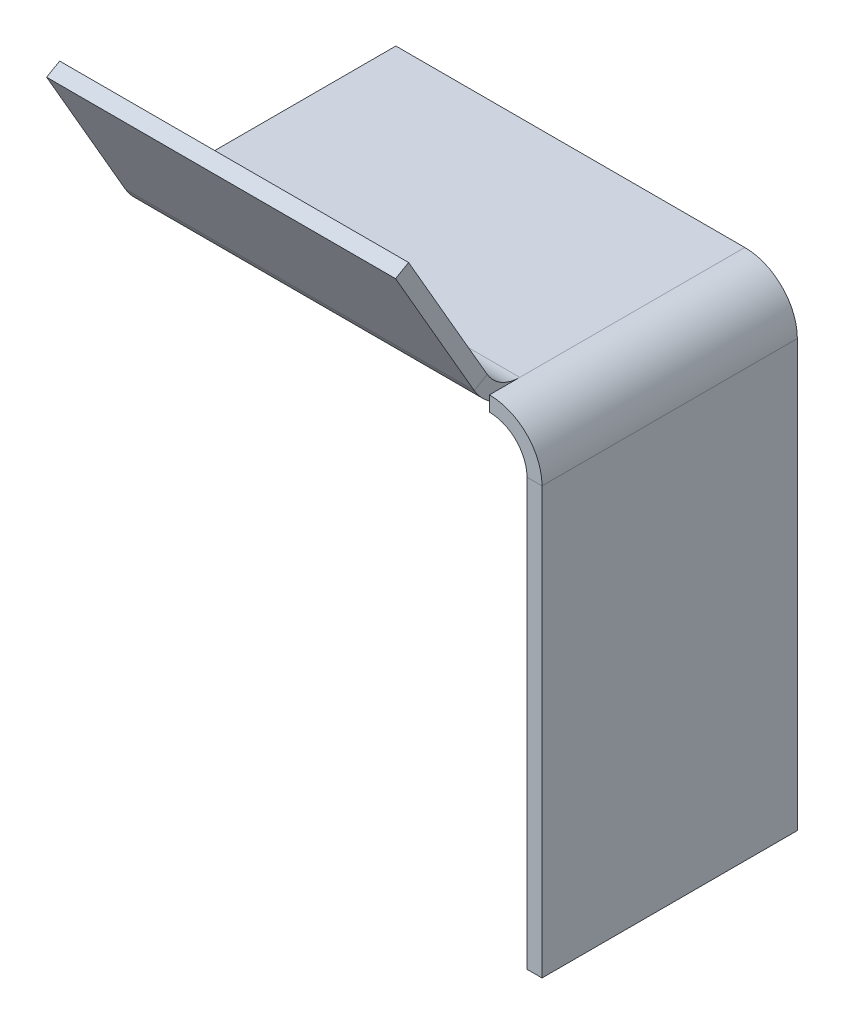
ISO-10303-21;
HEADER;
FILE_DESCRIPTION(('STEP AP214'),'2;1');
FILE_NAME('part.step','',(''),(''),'','','');
FILE_SCHEMA(('AUTOMOTIVE_DESIGN { 1 0 10303 214 1 1 1 1 }'));
ENDSEC;
DATA;
#1=APPLICATION_CONTEXT('core data for automotive mechanical design processes');
#2=APPLICATION_PROTOCOL_DEFINITION('international standard','automotive_design',2000,#1);
#3=PRODUCT_CONTEXT('',#1,'mechanical');
#4=PRODUCT('Part','Part','',(#3));
#5=PRODUCT_RELATED_PRODUCT_CATEGORY('part','',(#4));
#6=PRODUCT_DEFINITION_FORMATION('','',#4);
#7=PRODUCT_DEFINITION_CONTEXT('part definition',#1,'design');
#8=PRODUCT_DEFINITION('design','',#6,#7);
#9=PRODUCT_DEFINITION_SHAPE('','',#8);
#10=(LENGTH_UNIT() NAMED_UNIT(*) SI_UNIT(.MILLI.,.METRE.));
#11=(NAMED_UNIT(*) PLANE_ANGLE_UNIT() SI_UNIT($,.RADIAN.));
#12=(NAMED_UNIT(*) SI_UNIT($,.STERADIAN.) SOLID_ANGLE_UNIT());
#13=UNCERTAINTY_MEASURE_WITH_UNIT(LENGTH_MEASURE(1.E-05),#10,'distance_accuracy_value','');
#14=(GEOMETRIC_REPRESENTATION_CONTEXT(3) GLOBAL_UNCERTAINTY_ASSIGNED_CONTEXT((#13)) GLOBAL_UNIT_ASSIGNED_CONTEXT((#10,
#11,#12)) REPRESENTATION_CONTEXT('',''));
#15=CARTESIAN_POINT('',(0.,0.,0.));
#16=DIRECTION('',(0.,0.,1.));
#17=DIRECTION('',(1.,0.,0.));
#18=AXIS2_PLACEMENT_3D('',#15,#16,#17);
#19=CARTESIAN_POINT('',(-7.,63.7433555035391,34.));
#20=DIRECTION('',(-1.,0.,0.));
#21=DIRECTION('',(0.,0.,1.));
#22=AXIS2_PLACEMENT_3D('',#19,#20,#21);
#23=PLANE('',#22);
#24=DIRECTION('',(0.,1.,0.));
#25=VECTOR('',#24,1.);
#26=CARTESIAN_POINT('',(-7.,61.7433555035391,34.));
#27=LINE('',#26,#25);
#28=CARTESIAN_POINT('',(-7.,61.7433555035391,34.));
#29=VERTEX_POINT('',#28);
#30=CARTESIAN_POINT('',(-7.,63.027879437045,34.));
#31=VERTEX_POINT('',#30);
#32=EDGE_CURVE('E277',#29,#31,#27,.T.);
#33=ORIENTED_EDGE('',*,*,#32,.T.);
#34=CARTESIAN_POINT('',(-7.,68.7433555035391,29.9585481156727));
#35=DIRECTION('',(1.,0.,0.));
#36=DIRECTION('',(0.,0.,-1.));
#37=AXIS2_PLACEMENT_3D('',#34,#35,#36);
#38=CIRCLE('',#37,7.);
#39=CARTESIAN_POINT('',(-7.,61.7433555035391,29.9585481156727));
#40=VERTEX_POINT('',#39);
#41=EDGE_CURVE('E13',#31,#40,#38,.T.);
#42=ORIENTED_EDGE('',*,*,#41,.T.);
#43=DIRECTION('',(0.,0.,-1.));
#44=VECTOR('',#43,1.);
#45=CARTESIAN_POINT('',(-7.,61.7433555035391,34.));
#46=LINE('',#45,#44);
#47=EDGE_CURVE('E266',#29,#40,#46,.T.);
#48=ORIENTED_EDGE('',*,*,#47,.F.);
#49=EDGE_LOOP('',(#33,#42,#48));
#50=FACE_BOUND('',#49,.T.);
#51=ADVANCED_FACE('F54',(#50),#23,.T.);
#52=CARTESIAN_POINT('',(0.,63.7433555035391,34.));
#53=DIRECTION('',(0.,-1.,0.));
#54=DIRECTION('',(0.,0.,-1.));
#55=AXIS2_PLACEMENT_3D('',#52,#53,#54);
#56=PLANE('',#55);
#57=DIRECTION('',(1.,0.,0.));
#58=VECTOR('',#57,1.);
#59=CARTESIAN_POINT('',(-7.,63.7433555035391,29.9585481156727));
#60=LINE('',#59,#58);
#61=CARTESIAN_POINT('',(-7.,63.7433555035391,29.9585481156727));
#62=VERTEX_POINT('',#61);
#63=CARTESIAN_POINT('',(-53.4621691320006,63.7433555035391,29.9585481156727));
#64=VERTEX_POINT('',#63);
#65=EDGE_CURVE('E206',#62,#64,#60,.F.);
#66=ORIENTED_EDGE('',*,*,#65,.F.);
#67=DIRECTION('',(0.,0.,-1.));
#68=VECTOR('',#67,1.);
#69=CARTESIAN_POINT('',(-7.,63.7433555035391,34.));
#70=LINE('',#69,#68);
#71=CARTESIAN_POINT('',(-7.,63.7433555035391,0.));
#72=VERTEX_POINT('',#71);
#73=EDGE_CURVE('E229',#62,#72,#70,.T.);
#74=ORIENTED_EDGE('',*,*,#73,.T.);
#75=DIRECTION('',(-1.,0.,0.));
#76=VECTOR('',#75,1.);
#77=CARTESIAN_POINT('',(0.,63.7433555035391,0.));
#78=LINE('',#77,#76);
#79=CARTESIAN_POINT('',(-53.4621691320006,63.7433555035391,0.));
#80=VERTEX_POINT('',#79);
#81=EDGE_CURVE('E213',#72,#80,#78,.T.);
#82=ORIENTED_EDGE('',*,*,#81,.T.);
#83=DIRECTION('',(0.,0.,-1.));
#84=VECTOR('',#83,1.);
#85=CARTESIAN_POINT('',(-53.4621691320006,63.7433555035391,34.));
#86=LINE('',#85,#84);
#87=EDGE_CURVE('E271',#64,#80,#86,.T.);
#88=ORIENTED_EDGE('',*,*,#87,.F.);
#89=EDGE_LOOP('',(#66,#74,#82,#88));
#90=FACE_BOUND('',#89,.T.);
#91=ADVANCED_FACE('F321',(#90),#56,.F.);
#92=CARTESIAN_POINT('',(0.,61.7433555035391,34.));
#93=DIRECTION('',(0.,-1.,0.));
#94=DIRECTION('',(0.,0.,-1.));
#95=AXIS2_PLACEMENT_3D('',#92,#93,#94);
#96=PLANE('',#95);
#97=CARTESIAN_POINT('',(-7.,61.7433555035391,0.));
#98=VERTEX_POINT('',#97);
#99=EDGE_CURVE('E265',#40,#98,#46,.T.);
#100=ORIENTED_EDGE('',*,*,#99,.F.);
#101=DIRECTION('',(1.,0.,0.));
#102=VECTOR('',#101,1.);
#103=CARTESIAN_POINT('',(-7.,61.7433555035391,29.9585481156727));
#104=LINE('',#103,#102);
#105=CARTESIAN_POINT('',(-53.4621691320006,61.7433555035391,29.9585481156727));
#106=VERTEX_POINT('',#105);
#107=EDGE_CURVE('E197',#40,#106,#104,.F.);
#108=ORIENTED_EDGE('',*,*,#107,.T.);
#109=DIRECTION('',(0.,0.,-1.));
#110=VECTOR('',#109,1.);
#111=CARTESIAN_POINT('',(-53.4621691320006,61.7433555035391,34.));
#112=LINE('',#111,#110);
#113=CARTESIAN_POINT('',(-53.4621691320006,61.7433555035391,0.));
#114=VERTEX_POINT('',#113);
#115=EDGE_CURVE('E269',#106,#114,#112,.T.);
#116=ORIENTED_EDGE('',*,*,#115,.T.);
#117=DIRECTION('',(1.,0.,0.));
#118=VECTOR('',#117,1.);
#119=CARTESIAN_POINT('',(0.,61.7433555035391,0.));
#120=LINE('',#119,#118);
#121=EDGE_CURVE('E235',#98,#114,#120,.F.);
#122=ORIENTED_EDGE('',*,*,#121,.F.);
#123=EDGE_LOOP('',(#100,#108,#116,#122));
#124=FACE_BOUND('',#123,.T.);
#125=ADVANCED_FACE('F292',(#124),#96,.T.);
#126=CARTESIAN_POINT('',(0.,56.7433555035391,34.));
#127=DIRECTION('',(0.,0.,1.));
#128=DIRECTION('',(1.,0.,0.));
#129=AXIS2_PLACEMENT_3D('',#126,#127,#128);
#130=PLANE('',#129);
#131=DIRECTION('',(-1.,0.,0.));
#132=VECTOR('',#131,1.);
#133=CARTESIAN_POINT('',(0.,56.7433555035391,34.));
#134=LINE('',#133,#132);
#135=CARTESIAN_POINT('',(0.,56.7433555035391,34.));
#136=VERTEX_POINT('',#135);
#137=CARTESIAN_POINT('',(-2.,56.7433555035391,34.));
#138=VERTEX_POINT('',#137);
#139=EDGE_CURVE('E58',#136,#138,#134,.T.);
#140=ORIENTED_EDGE('',*,*,#139,.F.);
#141=CARTESIAN_POINT('',(-7.,56.7433555035391,34.));
#142=DIRECTION('',(0.,0.,-1.));
#143=DIRECTION('',(-1.,0.,0.));
#144=AXIS2_PLACEMENT_3D('',#141,#142,#143);
#145=CIRCLE('',#144,7.);
#146=CARTESIAN_POINT('',(-7.,63.7433555035391,34.));
#147=VERTEX_POINT('',#146);
#148=EDGE_CURVE('E227',#136,#147,#145,.F.);
#149=ORIENTED_EDGE('',*,*,#148,.T.);
#150=EDGE_CURVE('E71',#31,#147,#27,.T.);
#151=ORIENTED_EDGE('',*,*,#150,.F.);
#152=ORIENTED_EDGE('',*,*,#32,.F.);
#153=CARTESIAN_POINT('',(-7.,56.7433555035391,34.));
#154=DIRECTION('',(0.,0.,1.));
#155=DIRECTION('',(1.,0.,0.));
#156=AXIS2_PLACEMENT_3D('',#153,#154,#155);
#157=CIRCLE('',#156,5.);
#158=EDGE_CURVE('E214',#138,#29,#157,.T.);
#159=ORIENTED_EDGE('',*,*,#158,.F.);
#160=EDGE_LOOP('',(#140,#149,#151,#152,#159));
#161=FACE_BOUND('',#160,.T.);
#162=ADVANCED_FACE('F56',(#161),#130,.T.);
#163=CARTESIAN_POINT('',(-7.,61.7433555035391,34.));
#164=DIRECTION('',(0.,0.,1.));
#165=DIRECTION('',(1.,0.,0.));
#166=AXIS2_PLACEMENT_3D('',#163,#164,#165);
#167=PLANE('',#166);
#168=DIRECTION('',(0.,1.,0.));
#169=VECTOR('',#168,1.);
#170=CARTESIAN_POINT('',(0.,0.,34.));
#171=LINE('',#170,#169);
#172=CARTESIAN_POINT('',(0.,0.,34.));
#173=VERTEX_POINT('',#172);
#174=EDGE_CURVE('E224',#173,#136,#171,.T.);
#175=ORIENTED_EDGE('',*,*,#174,.T.);
#176=ORIENTED_EDGE('',*,*,#139,.T.);
#177=DIRECTION('',(0.,1.,0.));
#178=VECTOR('',#177,1.);
#179=CARTESIAN_POINT('',(-2.,0.,34.));
#180=LINE('',#179,#178);
#181=CARTESIAN_POINT('',(-2.,0.,34.));
#182=VERTEX_POINT('',#181);
#183=EDGE_CURVE('E217',#182,#138,#180,.T.);
#184=ORIENTED_EDGE('',*,*,#183,.F.);
#185=DIRECTION('',(-1.,0.,0.));
#186=VECTOR('',#185,1.);
#187=CARTESIAN_POINT('',(0.,0.,34.));
#188=LINE('',#187,#186);
#189=EDGE_CURVE('E221',#173,#182,#188,.T.);
#190=ORIENTED_EDGE('',*,*,#189,.F.);
#191=EDGE_LOOP('',(#175,#176,#184,#190));
#192=FACE_BOUND('',#191,.T.);
#193=ADVANCED_FACE('F304',(#192),#167,.T.);
#194=CARTESIAN_POINT('',(-7.,63.7433555035391,0.));
#195=DIRECTION('',(0.,0.,-1.));
#196=DIRECTION('',(-1.,0.,0.));
#197=AXIS2_PLACEMENT_3D('',#194,#195,#196);
#198=PLANE('',#197);
#199=DIRECTION('',(0.,-1.,0.));
#200=VECTOR('',#199,1.);
#201=CARTESIAN_POINT('',(-7.,63.7433555035391,0.));
#202=LINE('',#201,#200);
#203=EDGE_CURVE('E275',#72,#98,#202,.T.);
#204=ORIENTED_EDGE('',*,*,#203,.F.);
#205=CARTESIAN_POINT('',(-7.,56.7433555035391,0.));
#206=DIRECTION('',(0.,0.,-1.));
#207=DIRECTION('',(-1.,0.,0.));
#208=AXIS2_PLACEMENT_3D('',#205,#206,#207);
#209=CIRCLE('',#208,7.);
#210=CARTESIAN_POINT('',(0.,56.7433555035391,0.));
#211=VERTEX_POINT('',#210);
#212=EDGE_CURVE('E218',#211,#72,#209,.F.);
#213=ORIENTED_EDGE('',*,*,#212,.F.);
#214=DIRECTION('',(1.,0.,0.));
#215=VECTOR('',#214,1.);
#216=CARTESIAN_POINT('',(-2.,56.7433555035391,0.));
#217=LINE('',#216,#215);
#218=CARTESIAN_POINT('',(-2.,56.7433555035391,0.));
#219=VERTEX_POINT('',#218);
#220=EDGE_CURVE('E273',#219,#211,#217,.T.);
#221=ORIENTED_EDGE('',*,*,#220,.F.);
#222=CARTESIAN_POINT('',(-7.,56.7433555035391,0.));
#223=DIRECTION('',(0.,0.,1.));
#224=DIRECTION('',(1.,0.,0.));
#225=AXIS2_PLACEMENT_3D('',#222,#223,#224);
#226=CIRCLE('',#225,5.);
#227=EDGE_CURVE('E238',#219,#98,#226,.T.);
#228=ORIENTED_EDGE('',*,*,#227,.T.);
#229=EDGE_LOOP('',(#204,#213,#221,#228));
#230=FACE_BOUND('',#229,.T.);
#231=ADVANCED_FACE('F364',(#230),#198,.T.);
#232=CARTESIAN_POINT('',(-2.,56.7433555035391,0.));
#233=DIRECTION('',(0.,0.,-1.));
#234=DIRECTION('',(-1.,0.,0.));
#235=AXIS2_PLACEMENT_3D('',#232,#233,#234);
#236=PLANE('',#235);
#237=ORIENTED_EDGE('',*,*,#81,.F.);
#238=ORIENTED_EDGE('',*,*,#203,.T.);
#239=ORIENTED_EDGE('',*,*,#121,.T.);
#240=DIRECTION('',(0.,1.,0.));
#241=VECTOR('',#240,1.);
#242=CARTESIAN_POINT('',(-53.4621691320006,61.7433555035391,0.));
#243=LINE('',#242,#241);
#244=EDGE_CURVE('E232',#114,#80,#243,.T.);
#245=ORIENTED_EDGE('',*,*,#244,.T.);
#246=EDGE_LOOP('',(#237,#238,#239,#245));
#247=FACE_BOUND('',#246,.T.);
#248=ADVANCED_FACE('F360',(#247),#236,.T.);
#249=CARTESIAN_POINT('',(-53.4621691320006,61.7433555035391,34.));
#250=DIRECTION('',(-1.,0.,0.));
#251=DIRECTION('',(0.,0.,1.));
#252=AXIS2_PLACEMENT_3D('',#249,#250,#251);
#253=PLANE('',#252);
#254=DIRECTION('',(0.,-1.,0.));
#255=VECTOR('',#254,1.);
#256=CARTESIAN_POINT('',(-53.4621691320006,63.7433555035391,29.9585481156727));
#257=LINE('',#256,#255);
#258=EDGE_CURVE('E79',#64,#106,#257,.T.);
#259=ORIENTED_EDGE('',*,*,#258,.F.);
#260=ORIENTED_EDGE('',*,*,#87,.T.);
#261=ORIENTED_EDGE('',*,*,#244,.F.);
#262=ORIENTED_EDGE('',*,*,#115,.F.);
#263=EDGE_LOOP('',(#259,#260,#261,#262));
#264=FACE_BOUND('',#263,.T.);
#265=ADVANCED_FACE('F356',(#264),#253,.T.);
#266=CARTESIAN_POINT('',(-7.,56.7433555035391,34.));
#267=DIRECTION('',(0.,0.,-1.));
#268=DIRECTION('',(-1.,0.,0.));
#269=AXIS2_PLACEMENT_3D('',#266,#267,#268);
#270=CYLINDRICAL_SURFACE('',#269,5.);
#271=ORIENTED_EDGE('',*,*,#227,.F.);
#272=DIRECTION('',(0.,0.,-1.));
#273=VECTOR('',#272,1.);
#274=CARTESIAN_POINT('',(-2.,56.7433555035391,34.));
#275=LINE('',#274,#273);
#276=EDGE_CURVE('E262',#138,#219,#275,.T.);
#277=ORIENTED_EDGE('',*,*,#276,.F.);
#278=ORIENTED_EDGE('',*,*,#158,.T.);
#279=ORIENTED_EDGE('',*,*,#47,.T.);
#280=ORIENTED_EDGE('',*,*,#99,.T.);
#281=EDGE_LOOP('',(#271,#277,#278,#279,#280));
#282=FACE_BOUND('',#281,.T.);
#283=ADVANCED_FACE('F295',(#282),#270,.F.);
#284=CARTESIAN_POINT('',(-2.,0.,34.));
#285=DIRECTION('',(-1.,0.,0.));
#286=DIRECTION('',(0.,0.,1.));
#287=AXIS2_PLACEMENT_3D('',#284,#285,#286);
#288=PLANE('',#287);
#289=DIRECTION('',(0.,1.,0.));
#290=VECTOR('',#289,1.);
#291=CARTESIAN_POINT('',(-2.,0.,0.));
#292=LINE('',#291,#290);
#293=CARTESIAN_POINT('',(-2.,0.,0.));
#294=VERTEX_POINT('',#293);
#295=EDGE_CURVE('E241',#294,#219,#292,.T.);
#296=ORIENTED_EDGE('',*,*,#295,.F.);
#297=DIRECTION('',(0.,0.,-1.));
#298=VECTOR('',#297,1.);
#299=CARTESIAN_POINT('',(-2.,0.,34.));
#300=LINE('',#299,#298);
#301=EDGE_CURVE('E260',#182,#294,#300,.T.);
#302=ORIENTED_EDGE('',*,*,#301,.F.);
#303=ORIENTED_EDGE('',*,*,#183,.T.);
#304=ORIENTED_EDGE('',*,*,#276,.T.);
#305=EDGE_LOOP('',(#296,#302,#303,#304));
#306=FACE_BOUND('',#305,.T.);
#307=ADVANCED_FACE('F301',(#306),#288,.T.);
#308=CARTESIAN_POINT('',(0.,0.,34.));
#309=DIRECTION('',(0.,-1.,0.));
#310=DIRECTION('',(0.,0.,-1.));
#311=AXIS2_PLACEMENT_3D('',#308,#309,#310);
#312=PLANE('',#311);
#313=DIRECTION('',(-1.,0.,0.));
#314=VECTOR('',#313,1.);
#315=CARTESIAN_POINT('',(0.,0.,0.));
#316=LINE('',#315,#314);
#317=CARTESIAN_POINT('',(0.,0.,0.));
#318=VERTEX_POINT('',#317);
#319=EDGE_CURVE('E244',#318,#294,#316,.T.);
#320=ORIENTED_EDGE('',*,*,#319,.F.);
#321=DIRECTION('',(0.,0.,-1.));
#322=VECTOR('',#321,1.);
#323=CARTESIAN_POINT('',(0.,0.,34.));
#324=LINE('',#323,#322);
#325=EDGE_CURVE('E258',#173,#318,#324,.T.);
#326=ORIENTED_EDGE('',*,*,#325,.F.);
#327=ORIENTED_EDGE('',*,*,#189,.T.);
#328=ORIENTED_EDGE('',*,*,#301,.T.);
#329=EDGE_LOOP('',(#320,#326,#327,#328));
#330=FACE_BOUND('',#329,.T.);
#331=ADVANCED_FACE('F307',(#330),#312,.T.);
#332=CARTESIAN_POINT('',(0.,0.,34.));
#333=DIRECTION('',(-1.,0.,0.));
#334=DIRECTION('',(0.,0.,1.));
#335=AXIS2_PLACEMENT_3D('',#332,#333,#334);
#336=PLANE('',#335);
#337=DIRECTION('',(0.,1.,0.));
#338=VECTOR('',#337,1.);
#339=CARTESIAN_POINT('',(0.,0.,0.));
#340=LINE('',#339,#338);
#341=EDGE_CURVE('E247',#318,#211,#340,.T.);
#342=ORIENTED_EDGE('',*,*,#341,.T.);
#343=DIRECTION('',(0.,0.,-1.));
#344=VECTOR('',#343,1.);
#345=CARTESIAN_POINT('',(0.,56.7433555035391,34.));
#346=LINE('',#345,#344);
#347=EDGE_CURVE('E255',#136,#211,#346,.T.);
#348=ORIENTED_EDGE('',*,*,#347,.F.);
#349=ORIENTED_EDGE('',*,*,#174,.F.);
#350=ORIENTED_EDGE('',*,*,#325,.T.);
#351=EDGE_LOOP('',(#342,#348,#349,#350));
#352=FACE_BOUND('',#351,.T.);
#353=ADVANCED_FACE('F312',(#352),#336,.F.);
#354=CARTESIAN_POINT('',(-7.,56.7433555035391,34.));
#355=DIRECTION('',(0.,0.,-1.));
#356=DIRECTION('',(-1.,0.,0.));
#357=AXIS2_PLACEMENT_3D('',#354,#355,#356);
#358=CYLINDRICAL_SURFACE('',#357,7.);
#359=ORIENTED_EDGE('',*,*,#212,.T.);
#360=ORIENTED_EDGE('',*,*,#73,.F.);
#361=EDGE_CURVE('E252',#147,#62,#70,.T.);
#362=ORIENTED_EDGE('',*,*,#361,.F.);
#363=ORIENTED_EDGE('',*,*,#148,.F.);
#364=ORIENTED_EDGE('',*,*,#347,.T.);
#365=EDGE_LOOP('',(#359,#360,#362,#363,#364));
#366=FACE_BOUND('',#365,.T.);
#367=ADVANCED_FACE('F316',(#366),#358,.T.);
#368=CARTESIAN_POINT('',(-7.,56.7433555035391,0.));
#369=DIRECTION('',(0.,0.,1.));
#370=DIRECTION('',(1.,0.,0.));
#371=AXIS2_PLACEMENT_3D('',#368,#369,#370);
#372=PLANE('',#371);
#373=ORIENTED_EDGE('',*,*,#295,.T.);
#374=ORIENTED_EDGE('',*,*,#220,.T.);
#375=ORIENTED_EDGE('',*,*,#341,.F.);
#376=ORIENTED_EDGE('',*,*,#319,.T.);
#377=EDGE_LOOP('',(#373,#374,#375,#376));
#378=FACE_BOUND('',#377,.T.);
#379=ADVANCED_FACE('F329',(#378),#372,.F.);
#380=CARTESIAN_POINT('',(-53.4621691320006,68.7433555035391,29.9585481156727));
#381=DIRECTION('',(-1.,0.,0.));
#382=DIRECTION('',(0.,0.,1.));
#383=AXIS2_PLACEMENT_3D('',#380,#381,#382);
#384=PLANE('',#383);
#385=DIRECTION('',(0.,0.500000000000004,-0.866025403784436));
#386=VECTOR('',#385,1.);
#387=CARTESIAN_POINT('',(-53.4621691320006,65.2433555035391,36.0207259421637));
#388=LINE('',#387,#386);
#389=CARTESIAN_POINT('',(-53.4621691320006,66.2433555035391,34.2886751345948));
#390=VERTEX_POINT('',#389);
#391=CARTESIAN_POINT('',(-53.4621691320006,65.2433555035391,36.0207259421637));
#392=VERTEX_POINT('',#391);
#393=EDGE_CURVE('E179',#390,#392,#388,.F.);
#394=ORIENTED_EDGE('',*,*,#393,.F.);
#395=CARTESIAN_POINT('',(-53.4621691320006,68.7433555035391,29.9585481156727));
#396=DIRECTION('',(1.,0.,0.));
#397=DIRECTION('',(0.,0.,-1.));
#398=AXIS2_PLACEMENT_3D('',#395,#396,#397);
#399=CIRCLE('',#398,5.);
#400=EDGE_CURVE('E203',#64,#390,#399,.F.);
#401=ORIENTED_EDGE('',*,*,#400,.F.);
#402=ORIENTED_EDGE('',*,*,#258,.T.);
#403=CARTESIAN_POINT('',(-53.4621691320006,68.7433555035391,29.9585481156727));
#404=DIRECTION('',(1.,0.,0.));
#405=DIRECTION('',(0.,0.,-1.));
#406=AXIS2_PLACEMENT_3D('',#403,#404,#405);
#407=CIRCLE('',#406,7.);
#408=EDGE_CURVE('E199',#106,#392,#407,.F.);
#409=ORIENTED_EDGE('',*,*,#408,.T.);
#410=EDGE_LOOP('',(#394,#401,#402,#409));
#411=FACE_BOUND('',#410,.T.);
#412=ADVANCED_FACE('F327',(#411),#384,.T.);
#413=CARTESIAN_POINT('',(-7.,68.7433555035391,29.9585481156727));
#414=DIRECTION('',(-1.,0.,0.));
#415=DIRECTION('',(0.,0.,1.));
#416=AXIS2_PLACEMENT_3D('',#413,#414,#415);
#417=PLANE('',#416);
#418=CARTESIAN_POINT('',(-7.,65.2433555035391,36.0207259421637));
#419=VERTEX_POINT('',#418);
#420=EDGE_CURVE('E64',#419,#31,#38,.T.);
#421=ORIENTED_EDGE('',*,*,#420,.T.);
#422=ORIENTED_EDGE('',*,*,#150,.T.);
#423=ORIENTED_EDGE('',*,*,#361,.T.);
#424=CARTESIAN_POINT('',(-7.,68.7433555035391,29.9585481156727));
#425=DIRECTION('',(1.,0.,0.));
#426=DIRECTION('',(0.,0.,-1.));
#427=AXIS2_PLACEMENT_3D('',#424,#425,#426);
#428=CIRCLE('',#427,5.);
#429=CARTESIAN_POINT('',(-7.,66.2433555035391,34.2886751345948));
#430=VERTEX_POINT('',#429);
#431=EDGE_CURVE('E209',#430,#62,#428,.T.);
#432=ORIENTED_EDGE('',*,*,#431,.F.);
#433=DIRECTION('',(0.,0.500000000000004,-0.866025403784436));
#434=VECTOR('',#433,1.);
#435=CARTESIAN_POINT('',(-7.,66.2433555035391,34.2886751345948));
#436=LINE('',#435,#434);
#437=EDGE_CURVE('E191',#430,#419,#436,.F.);
#438=ORIENTED_EDGE('',*,*,#437,.T.);
#439=EDGE_LOOP('',(#421,#422,#423,#432,#438));
#440=FACE_BOUND('',#439,.T.);
#441=ADVANCED_FACE('F282',(#440),#417,.F.);
#442=CARTESIAN_POINT('',(-7.,68.7433555035391,29.9585481156727));
#443=DIRECTION('',(1.,0.,0.));
#444=DIRECTION('',(0.,-0.500000000000004,0.866025403784436));
#445=AXIS2_PLACEMENT_3D('',#442,#443,#444);
#446=CYLINDRICAL_SURFACE('',#445,7.);
#447=ORIENTED_EDGE('',*,*,#107,.F.);
#448=ORIENTED_EDGE('',*,*,#41,.F.);
#449=ORIENTED_EDGE('',*,*,#420,.F.);
#450=DIRECTION('',(1.,0.,0.));
#451=VECTOR('',#450,1.);
#452=CARTESIAN_POINT('',(-53.4621691320006,65.2433555035391,36.0207259421637));
#453=LINE('',#452,#451);
#454=EDGE_CURVE('E189',#419,#392,#453,.F.);
#455=ORIENTED_EDGE('',*,*,#454,.T.);
#456=ORIENTED_EDGE('',*,*,#408,.F.);
#457=EDGE_LOOP('',(#447,#448,#449,#455,#456));
#458=FACE_BOUND('',#457,.T.);
#459=ADVANCED_FACE('F287',(#458),#446,.T.);
#460=CARTESIAN_POINT('',(-7.,68.7433555035391,29.9585481156727));
#461=DIRECTION('',(1.,0.,0.));
#462=DIRECTION('',(0.,-0.500000000000004,0.866025403784436));
#463=AXIS2_PLACEMENT_3D('',#460,#461,#462);
#464=CYLINDRICAL_SURFACE('',#463,5.);
#465=ORIENTED_EDGE('',*,*,#65,.T.);
#466=ORIENTED_EDGE('',*,*,#400,.T.);
#467=DIRECTION('',(1.,0.,0.));
#468=VECTOR('',#467,1.);
#469=CARTESIAN_POINT('',(-53.4621691320006,66.2433555035391,34.2886751345948));
#470=LINE('',#469,#468);
#471=EDGE_CURVE('E194',#390,#430,#470,.T.);
#472=ORIENTED_EDGE('',*,*,#471,.T.);
#473=ORIENTED_EDGE('',*,*,#431,.T.);
#474=EDGE_LOOP('',(#465,#466,#472,#473));
#475=FACE_BOUND('',#474,.T.);
#476=ADVANCED_FACE('F324',(#475),#464,.F.);
#477=CARTESIAN_POINT('',(-7.,83.39399059815,46.5000000000001));
#478=DIRECTION('',(-1.,0.,0.));
#479=DIRECTION('',(0.,-1.,0.));
#480=AXIS2_PLACEMENT_3D('',#477,#478,#479);
#481=PLANE('',#480);
#482=ORIENTED_EDGE('',*,*,#437,.F.);
#483=DIRECTION('',(0.,-0.866025403784436,-0.500000000000004));
#484=VECTOR('',#483,1.);
#485=CARTESIAN_POINT('',(-7.,84.39399059815,44.7679491924312));
#486=LINE('',#485,#484);
#487=CARTESIAN_POINT('',(-7.,84.39399059815,44.7679491924312));
#488=VERTEX_POINT('',#487);
#489=EDGE_CURVE('E187',#430,#488,#486,.F.);
#490=ORIENTED_EDGE('',*,*,#489,.T.);
#491=DIRECTION('',(0.,0.500000000000004,-0.866025403784436));
#492=VECTOR('',#491,1.);
#493=CARTESIAN_POINT('',(-7.,83.39399059815,46.5000000000001));
#494=LINE('',#493,#492);
#495=CARTESIAN_POINT('',(-7.,83.39399059815,46.5000000000001));
#496=VERTEX_POINT('',#495);
#497=EDGE_CURVE('E175',#496,#488,#494,.T.);
#498=ORIENTED_EDGE('',*,*,#497,.F.);
#499=DIRECTION('',(0.,0.866025403784436,0.500000000000004));
#500=VECTOR('',#499,1.);
#501=CARTESIAN_POINT('',(-6.99999999999999,0.213407011549491,-1.5243323250744));
#502=LINE('',#501,#500);
#503=EDGE_CURVE('E162',#419,#496,#502,.T.);
#504=ORIENTED_EDGE('',*,*,#503,.F.);
#505=EDGE_LOOP('',(#482,#490,#498,#504));
#506=FACE_BOUND('',#505,.T.);
#507=ADVANCED_FACE('F505',(#506),#481,.F.);
#508=CARTESIAN_POINT('',(-53.4621691320006,62.7433555035391,34.5773502691896));
#509=DIRECTION('',(1.,0.,0.));
#510=DIRECTION('',(0.,0.,-1.));
#511=AXIS2_PLACEMENT_3D('',#508,#509,#510);
#512=PLANE('',#511);
#513=ORIENTED_EDGE('',*,*,#393,.T.);
#514=DIRECTION('',(0.,-0.866025403784436,-0.500000000000004));
#515=VECTOR('',#514,1.);
#516=CARTESIAN_POINT('',(-53.4621691320006,0.213407011549492,-1.5243323250744));
#517=LINE('',#516,#515);
#518=CARTESIAN_POINT('',(-53.4621691320006,83.39399059815,46.5000000000001));
#519=VERTEX_POINT('',#518);
#520=EDGE_CURVE('E160',#519,#392,#517,.T.);
#521=ORIENTED_EDGE('',*,*,#520,.F.);
#522=DIRECTION('',(0.,0.500000000000004,-0.866025403784436));
#523=VECTOR('',#522,1.);
#524=CARTESIAN_POINT('',(-53.4621691320006,83.39399059815,46.5000000000001));
#525=LINE('',#524,#523);
#526=CARTESIAN_POINT('',(-53.4621691320006,84.39399059815,44.7679491924312));
#527=VERTEX_POINT('',#526);
#528=EDGE_CURVE('E168',#519,#527,#525,.T.);
#529=ORIENTED_EDGE('',*,*,#528,.T.);
#530=DIRECTION('',(0.,0.866025403784436,0.500000000000004));
#531=VECTOR('',#530,1.);
#532=CARTESIAN_POINT('',(-53.4621691320006,63.7433555035391,32.8452994616208));
#533=LINE('',#532,#531);
#534=EDGE_CURVE('E184',#527,#390,#533,.F.);
#535=ORIENTED_EDGE('',*,*,#534,.T.);
#536=EDGE_LOOP('',(#513,#521,#529,#535));
#537=FACE_BOUND('',#536,.T.);
#538=ADVANCED_FACE('F178',(#537),#512,.F.);
#539=CARTESIAN_POINT('',(0.,0.213407011549492,-1.5243323250744));
#540=DIRECTION('',(0.,0.500000000000004,-0.866025403784436));
#541=DIRECTION('',(0.,0.866025403784436,0.500000000000004));
#542=AXIS2_PLACEMENT_3D('',#539,#540,#541);
#543=PLANE('',#542);
#544=ORIENTED_EDGE('',*,*,#454,.F.);
#545=ORIENTED_EDGE('',*,*,#503,.T.);
#546=DIRECTION('',(-1.,0.,0.));
#547=VECTOR('',#546,1.);
#548=CARTESIAN_POINT('',(0.,83.39399059815,46.5000000000001));
#549=LINE('',#548,#547);
#550=EDGE_CURVE('E155',#496,#519,#549,.T.);
#551=ORIENTED_EDGE('',*,*,#550,.T.);
#552=ORIENTED_EDGE('',*,*,#520,.T.);
#553=EDGE_LOOP('',(#544,#545,#551,#552));
#554=FACE_BOUND('',#553,.T.);
#555=ADVANCED_FACE('F158',(#554),#543,.F.);
#556=CARTESIAN_POINT('',(0.,1.2134070115495,-3.25638313264328));
#557=DIRECTION('',(0.,0.500000000000004,-0.866025403784436));
#558=DIRECTION('',(0.,0.866025403784436,0.500000000000004));
#559=AXIS2_PLACEMENT_3D('',#556,#557,#558);
#560=PLANE('',#559);
#561=ORIENTED_EDGE('',*,*,#489,.F.);
#562=ORIENTED_EDGE('',*,*,#471,.F.);
#563=ORIENTED_EDGE('',*,*,#534,.F.);
#564=DIRECTION('',(1.,0.,0.));
#565=VECTOR('',#564,1.);
#566=CARTESIAN_POINT('',(-53.4621691320006,84.39399059815,44.7679491924312));
#567=LINE('',#566,#565);
#568=EDGE_CURVE('E171',#488,#527,#567,.F.);
#569=ORIENTED_EDGE('',*,*,#568,.F.);
#570=EDGE_LOOP('',(#561,#562,#563,#569));
#571=FACE_BOUND('',#570,.T.);
#572=ADVANCED_FACE('F533',(#571),#560,.T.);
#573=CARTESIAN_POINT('',(-53.4621691320006,83.39399059815,46.5000000000001));
#574=DIRECTION('',(0.,-0.866025403784436,-0.500000000000004));
#575=DIRECTION('',(0.,0.500000000000004,-0.866025403784436));
#576=AXIS2_PLACEMENT_3D('',#573,#574,#575);
#577=PLANE('',#576);
#578=ORIENTED_EDGE('',*,*,#568,.T.);
#579=ORIENTED_EDGE('',*,*,#528,.F.);
#580=ORIENTED_EDGE('',*,*,#550,.F.);
#581=ORIENTED_EDGE('',*,*,#497,.T.);
#582=EDGE_LOOP('',(#578,#579,#580,#581));
#583=FACE_BOUND('',#582,.T.);
#584=ADVANCED_FACE('F169',(#583),#577,.F.);
#585=CLOSED_SHELL('',(#51,#91,#125,#162,#193,#231,#248,#265,#283,#307,#331,#353,#367,#379,#412,
#441,#459,#476,#507,#538,#555,#572,#584));
#586=MANIFOLD_SOLID_BREP('B2',#585);
#587=ADVANCED_BREP_SHAPE_REPRESENTATION('',(#18,#586),#14);
#588=SHAPE_DEFINITION_REPRESENTATION(#9,#587);
ENDSEC;
END-ISO-10303-21;
